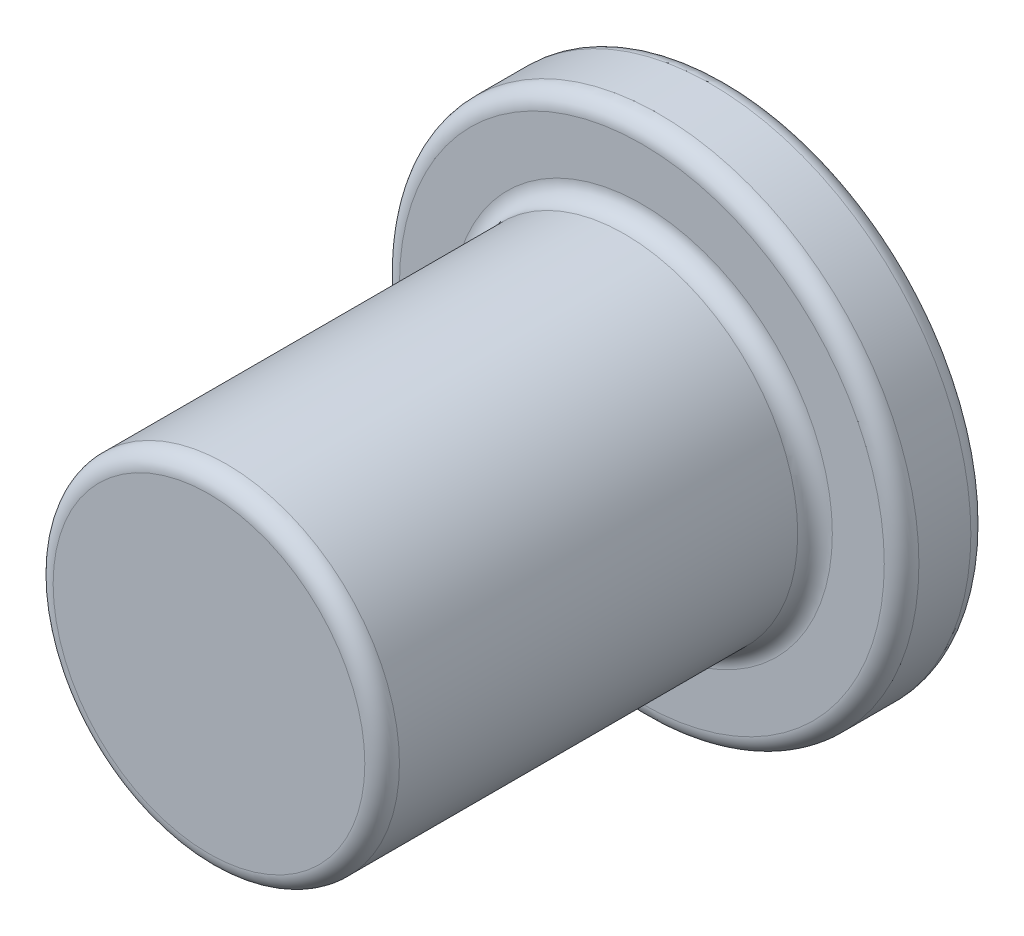
ISO-10303-21;
HEADER;
FILE_DESCRIPTION(('STEP AP214'),'2;1');
FILE_NAME('part.step','',(''),(''),'','','');
FILE_SCHEMA(('AUTOMOTIVE_DESIGN { 1 0 10303 214 1 1 1 1 }'));
ENDSEC;
DATA;
#1=APPLICATION_CONTEXT('core data for automotive mechanical design processes');
#2=APPLICATION_PROTOCOL_DEFINITION('international standard','automotive_design',2000,#1);
#3=PRODUCT_CONTEXT('',#1,'mechanical');
#4=PRODUCT('Part','Part','',(#3));
#5=PRODUCT_RELATED_PRODUCT_CATEGORY('part','',(#4));
#6=PRODUCT_DEFINITION_FORMATION('','',#4);
#7=PRODUCT_DEFINITION_CONTEXT('part definition',#1,'design');
#8=PRODUCT_DEFINITION('design','',#6,#7);
#9=PRODUCT_DEFINITION_SHAPE('','',#8);
#10=(LENGTH_UNIT() NAMED_UNIT(*) SI_UNIT(.MILLI.,.METRE.));
#11=(NAMED_UNIT(*) PLANE_ANGLE_UNIT() SI_UNIT($,.RADIAN.));
#12=(NAMED_UNIT(*) SI_UNIT($,.STERADIAN.) SOLID_ANGLE_UNIT());
#13=UNCERTAINTY_MEASURE_WITH_UNIT(LENGTH_MEASURE(1.E-05),#10,'distance_accuracy_value','');
#14=(GEOMETRIC_REPRESENTATION_CONTEXT(3) GLOBAL_UNCERTAINTY_ASSIGNED_CONTEXT((#13)) GLOBAL_UNIT_ASSIGNED_CONTEXT((#10,
#11,#12)) REPRESENTATION_CONTEXT('',''));
#15=CARTESIAN_POINT('',(0.,0.,0.));
#16=DIRECTION('',(0.,0.,1.));
#17=DIRECTION('',(1.,0.,0.));
#18=AXIS2_PLACEMENT_3D('',#15,#16,#17);
#19=CARTESIAN_POINT('',(0.,0.,0.5));
#20=DIRECTION('',(0.,0.,-1.));
#21=DIRECTION('',(-1.,0.,0.));
#22=AXIS2_PLACEMENT_3D('',#19,#20,#21);
#23=CYLINDRICAL_SURFACE('',#22,3.);
#24=CARTESIAN_POINT('',(0.,0.,0.3));
#25=DIRECTION('',(0.,0.,1.));
#26=DIRECTION('',(1.,0.,0.));
#27=AXIS2_PLACEMENT_3D('',#24,#25,#26);
#28=CIRCLE('',#27,3.);
#29=CARTESIAN_POINT('',(3.,0.,0.3));
#30=VERTEX_POINT('',#29);
#31=EDGE_CURVE('E49',#30,#30,#28,.F.);
#32=ORIENTED_EDGE('',*,*,#31,.T.);
#33=EDGE_LOOP('',(#32));
#34=FACE_BOUND('',#33,.T.);
#35=CARTESIAN_POINT('',(0.,0.,-0.3));
#36=DIRECTION('',(0.,0.,1.));
#37=DIRECTION('',(1.,0.,0.));
#38=AXIS2_PLACEMENT_3D('',#35,#36,#37);
#39=CIRCLE('',#38,3.);
#40=CARTESIAN_POINT('',(3.,0.,-0.3));
#41=VERTEX_POINT('',#40);
#42=EDGE_CURVE('E54',#41,#41,#39,.T.);
#43=ORIENTED_EDGE('',*,*,#42,.T.);
#44=EDGE_LOOP('',(#43));
#45=FACE_BOUND('',#44,.T.);
#46=ADVANCED_FACE('F41',(#34,#45),#23,.T.);
#47=CARTESIAN_POINT('',(0.,0.,0.5));
#48=DIRECTION('',(0.,0.,1.));
#49=DIRECTION('',(1.,0.,0.));
#50=AXIS2_PLACEMENT_3D('',#47,#48,#49);
#51=PLANE('',#50);
#52=CARTESIAN_POINT('',(0.,0.,0.5));
#53=DIRECTION('',(0.,0.,1.));
#54=DIRECTION('',(1.,0.,0.));
#55=AXIS2_PLACEMENT_3D('',#52,#53,#54);
#56=CIRCLE('',#55,2.2);
#57=CARTESIAN_POINT('',(2.2,0.,0.5));
#58=VERTEX_POINT('',#57);
#59=EDGE_CURVE('E65',#58,#58,#56,.F.);
#60=ORIENTED_EDGE('',*,*,#59,.T.);
#61=EDGE_LOOP('',(#60));
#62=FACE_BOUND('',#61,.T.);
#63=CARTESIAN_POINT('',(0.,0.,0.5));
#64=DIRECTION('',(0.,0.,1.));
#65=DIRECTION('',(1.,0.,0.));
#66=AXIS2_PLACEMENT_3D('',#63,#64,#65);
#67=CIRCLE('',#66,2.8);
#68=CARTESIAN_POINT('',(2.8,0.,0.5));
#69=VERTEX_POINT('',#68);
#70=EDGE_CURVE('E69',#69,#69,#67,.T.);
#71=ORIENTED_EDGE('',*,*,#70,.T.);
#72=EDGE_LOOP('',(#71));
#73=FACE_BOUND('',#72,.T.);
#74=ADVANCED_FACE('F105',(#62,#73),#51,.T.);
#75=CARTESIAN_POINT('',(0.,0.,-0.5));
#76=DIRECTION('',(0.,0.,1.));
#77=DIRECTION('',(1.,0.,0.));
#78=AXIS2_PLACEMENT_3D('',#75,#76,#77);
#79=PLANE('',#78);
#80=CARTESIAN_POINT('',(0.,0.,-0.5));
#81=DIRECTION('',(0.,0.,1.));
#82=DIRECTION('',(1.,0.,0.));
#83=AXIS2_PLACEMENT_3D('',#80,#81,#82);
#84=CIRCLE('',#83,2.8);
#85=CARTESIAN_POINT('',(2.8,0.,-0.5));
#86=VERTEX_POINT('',#85);
#87=EDGE_CURVE('E10',#86,#86,#84,.F.);
#88=ORIENTED_EDGE('',*,*,#87,.T.);
#89=EDGE_LOOP('',(#88));
#90=FACE_BOUND('',#89,.T.);
#91=ADVANCED_FACE('F101',(#90),#79,.F.);
#92=CARTESIAN_POINT('',(0.,0.,5.5));
#93=DIRECTION('',(0.,0.,-1.));
#94=DIRECTION('',(-1.,0.,0.));
#95=AXIS2_PLACEMENT_3D('',#92,#93,#94);
#96=CYLINDRICAL_SURFACE('',#95,2.);
#97=CARTESIAN_POINT('',(0.,0.,0.7));
#98=DIRECTION('',(0.,0.,1.));
#99=DIRECTION('',(1.,0.,0.));
#100=AXIS2_PLACEMENT_3D('',#97,#98,#99);
#101=CIRCLE('',#100,2.);
#102=CARTESIAN_POINT('',(2.,0.,0.7));
#103=VERTEX_POINT('',#102);
#104=EDGE_CURVE('E73',#103,#103,#101,.T.);
#105=ORIENTED_EDGE('',*,*,#104,.T.);
#106=EDGE_LOOP('',(#105));
#107=FACE_BOUND('',#106,.T.);
#108=CARTESIAN_POINT('',(0.,0.,5.3));
#109=DIRECTION('',(0.,0.,1.));
#110=DIRECTION('',(1.,0.,0.));
#111=AXIS2_PLACEMENT_3D('',#108,#109,#110);
#112=CIRCLE('',#111,2.);
#113=CARTESIAN_POINT('',(2.,0.,5.3));
#114=VERTEX_POINT('',#113);
#115=EDGE_CURVE('E77',#114,#114,#112,.F.);
#116=ORIENTED_EDGE('',*,*,#115,.T.);
#117=EDGE_LOOP('',(#116));
#118=FACE_BOUND('',#117,.T.);
#119=ADVANCED_FACE('F82',(#107,#118),#96,.T.);
#120=CARTESIAN_POINT('',(0.,0.,5.5));
#121=DIRECTION('',(0.,0.,1.));
#122=DIRECTION('',(1.,0.,0.));
#123=AXIS2_PLACEMENT_3D('',#120,#121,#122);
#124=PLANE('',#123);
#125=CARTESIAN_POINT('',(0.,0.,5.5));
#126=DIRECTION('',(0.,0.,1.));
#127=DIRECTION('',(1.,0.,0.));
#128=AXIS2_PLACEMENT_3D('',#125,#126,#127);
#129=CIRCLE('',#128,1.8);
#130=CARTESIAN_POINT('',(1.8,0.,5.5));
#131=VERTEX_POINT('',#130);
#132=EDGE_CURVE('E59',#131,#131,#129,.T.);
#133=ORIENTED_EDGE('',*,*,#132,.T.);
#134=EDGE_LOOP('',(#133));
#135=FACE_BOUND('',#134,.T.);
#136=ADVANCED_FACE('F92',(#135),#124,.T.);
#137=CARTESIAN_POINT('',(0.,0.,0.7));
#138=DIRECTION('',(0.,0.,1.));
#139=DIRECTION('',(1.,0.,0.));
#140=AXIS2_PLACEMENT_3D('',#137,#138,#139);
#141=TOROIDAL_SURFACE('',#140,2.2,0.2);
#142=ORIENTED_EDGE('',*,*,#59,.F.);
#143=EDGE_LOOP('',(#142));
#144=FACE_BOUND('',#143,.T.);
#145=ORIENTED_EDGE('',*,*,#104,.F.);
#146=EDGE_LOOP('',(#145));
#147=FACE_BOUND('',#146,.T.);
#148=ADVANCED_FACE('F88',(#144,#147),#141,.F.);
#149=CARTESIAN_POINT('',(0.,0.,5.3));
#150=DIRECTION('',(0.,0.,1.));
#151=DIRECTION('',(1.,0.,0.));
#152=AXIS2_PLACEMENT_3D('',#149,#150,#151);
#153=TOROIDAL_SURFACE('',#152,1.8,0.2);
#154=ORIENTED_EDGE('',*,*,#115,.F.);
#155=EDGE_LOOP('',(#154));
#156=FACE_BOUND('',#155,.T.);
#157=ORIENTED_EDGE('',*,*,#132,.F.);
#158=EDGE_LOOP('',(#157));
#159=FACE_BOUND('',#158,.T.);
#160=ADVANCED_FACE('F84',(#156,#159),#153,.T.);
#161=CARTESIAN_POINT('',(0.,0.,0.3));
#162=DIRECTION('',(0.,0.,1.));
#163=DIRECTION('',(1.,0.,0.));
#164=AXIS2_PLACEMENT_3D('',#161,#162,#163);
#165=TOROIDAL_SURFACE('',#164,2.8,0.2);
#166=ORIENTED_EDGE('',*,*,#31,.F.);
#167=EDGE_LOOP('',(#166));
#168=FACE_BOUND('',#167,.T.);
#169=ORIENTED_EDGE('',*,*,#70,.F.);
#170=EDGE_LOOP('',(#169));
#171=FACE_BOUND('',#170,.T.);
#172=ADVANCED_FACE('F87',(#168,#171),#165,.T.);
#173=CARTESIAN_POINT('',(0.,0.,-0.3));
#174=DIRECTION('',(0.,0.,1.));
#175=DIRECTION('',(1.,0.,0.));
#176=AXIS2_PLACEMENT_3D('',#173,#174,#175);
#177=TOROIDAL_SURFACE('',#176,2.8,0.2);
#178=ORIENTED_EDGE('',*,*,#87,.F.);
#179=EDGE_LOOP('',(#178));
#180=FACE_BOUND('',#179,.T.);
#181=ORIENTED_EDGE('',*,*,#42,.F.);
#182=EDGE_LOOP('',(#181));
#183=FACE_BOUND('',#182,.T.);
#184=ADVANCED_FACE('F43',(#180,#183),#177,.T.);
#185=CLOSED_SHELL('',(#46,#74,#91,#119,#136,#148,#160,#172,#184));
#186=MANIFOLD_SOLID_BREP('B2',#185);
#187=ADVANCED_BREP_SHAPE_REPRESENTATION('',(#18,#186),#14);
#188=SHAPE_DEFINITION_REPRESENTATION(#9,#187);
ENDSEC;
END-ISO-10303-21;
